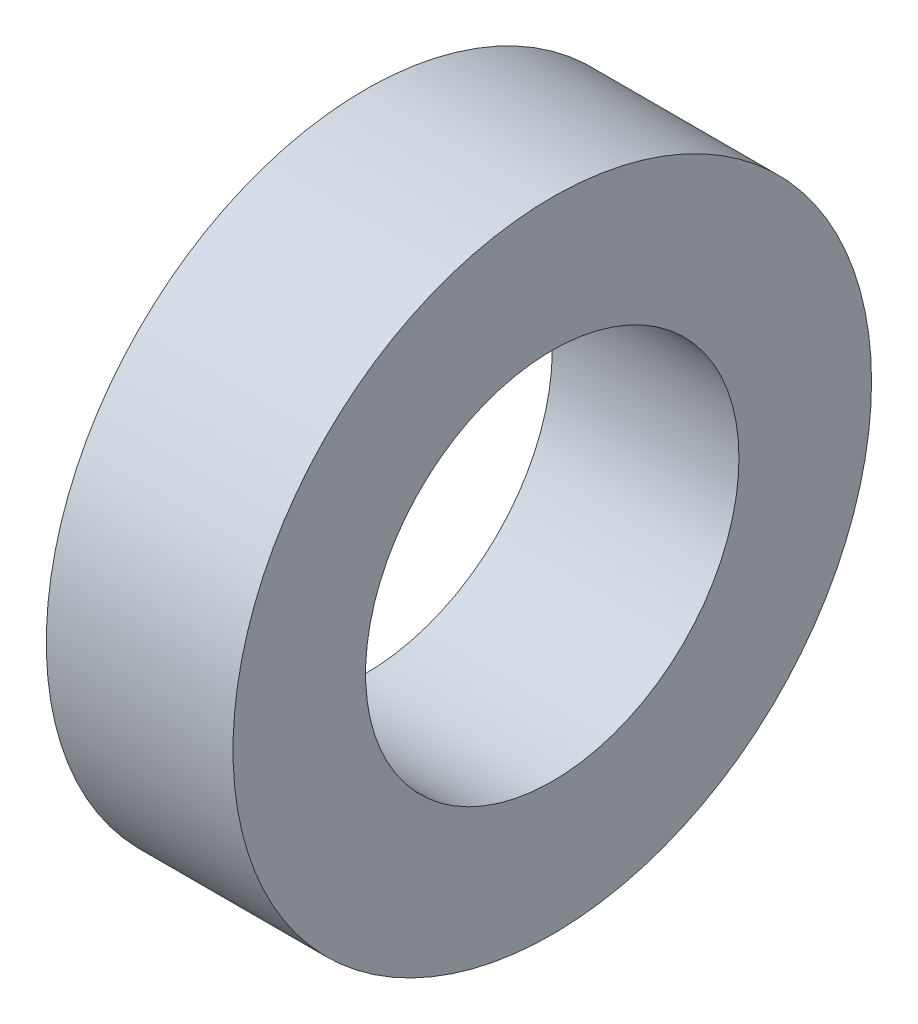
ISO-10303-21;
HEADER;
FILE_DESCRIPTION(('STEP AP214'),'2;1');
FILE_NAME('part.step','',(''),(''),'','','');
FILE_SCHEMA(('AUTOMOTIVE_DESIGN { 1 0 10303 214 1 1 1 1 }'));
ENDSEC;
DATA;
#1=APPLICATION_CONTEXT('core data for automotive mechanical design processes');
#2=APPLICATION_PROTOCOL_DEFINITION('international standard','automotive_design',2000,#1);
#3=PRODUCT_CONTEXT('',#1,'mechanical');
#4=PRODUCT('Part','Part','',(#3));
#5=PRODUCT_RELATED_PRODUCT_CATEGORY('part','',(#4));
#6=PRODUCT_DEFINITION_FORMATION('','',#4);
#7=PRODUCT_DEFINITION_CONTEXT('part definition',#1,'design');
#8=PRODUCT_DEFINITION('design','',#6,#7);
#9=PRODUCT_DEFINITION_SHAPE('','',#8);
#10=(LENGTH_UNIT() NAMED_UNIT(*) SI_UNIT(.MILLI.,.METRE.));
#11=(NAMED_UNIT(*) PLANE_ANGLE_UNIT() SI_UNIT($,.RADIAN.));
#12=(NAMED_UNIT(*) SI_UNIT($,.STERADIAN.) SOLID_ANGLE_UNIT());
#13=UNCERTAINTY_MEASURE_WITH_UNIT(LENGTH_MEASURE(1.E-05),#10,'distance_accuracy_value','');
#14=(GEOMETRIC_REPRESENTATION_CONTEXT(3) GLOBAL_UNCERTAINTY_ASSIGNED_CONTEXT((#13)) GLOBAL_UNIT_ASSIGNED_CONTEXT((#10,
#11,#12)) REPRESENTATION_CONTEXT('',''));
#15=CARTESIAN_POINT('',(0.,0.,0.));
#16=DIRECTION('',(0.,0.,1.));
#17=DIRECTION('',(1.,0.,0.));
#18=AXIS2_PLACEMENT_3D('',#15,#16,#17);
#19=CARTESIAN_POINT('',(5.,0.,0.));
#20=DIRECTION('',(-1.,0.,0.));
#21=DIRECTION('',(0.,0.,1.));
#22=AXIS2_PLACEMENT_3D('',#19,#20,#21);
#23=CYLINDRICAL_SURFACE('',#22,8.55);
#24=CARTESIAN_POINT('',(5.,0.,0.));
#25=DIRECTION('',(1.,0.,0.));
#26=DIRECTION('',(0.,0.,-1.));
#27=AXIS2_PLACEMENT_3D('',#24,#25,#26);
#28=CIRCLE('',#27,8.55);
#29=CARTESIAN_POINT('',(5.,0.,-8.55));
#30=VERTEX_POINT('',#29);
#31=EDGE_CURVE('E10',#30,#30,#28,.T.);
#32=ORIENTED_EDGE('',*,*,#31,.F.);
#33=EDGE_LOOP('',(#32));
#34=FACE_BOUND('',#33,.T.);
#35=CARTESIAN_POINT('',(0.,0.,0.));
#36=DIRECTION('',(1.,0.,0.));
#37=DIRECTION('',(0.,0.,-1.));
#38=AXIS2_PLACEMENT_3D('',#35,#36,#37);
#39=CIRCLE('',#38,8.55);
#40=CARTESIAN_POINT('',(0.,0.,-8.55));
#41=VERTEX_POINT('',#40);
#42=EDGE_CURVE('E36',#41,#41,#39,.T.);
#43=ORIENTED_EDGE('',*,*,#42,.T.);
#44=EDGE_LOOP('',(#43));
#45=FACE_BOUND('',#44,.T.);
#46=ADVANCED_FACE('F33',(#34,#45),#23,.T.);
#47=CARTESIAN_POINT('',(5.,0.,0.));
#48=DIRECTION('',(1.,0.,0.));
#49=DIRECTION('',(0.,0.,-1.));
#50=AXIS2_PLACEMENT_3D('',#47,#48,#49);
#51=PLANE('',#50);
#52=CARTESIAN_POINT('',(5.,0.,0.));
#53=DIRECTION('',(1.,0.,0.));
#54=DIRECTION('',(0.,0.,-1.));
#55=AXIS2_PLACEMENT_3D('',#52,#53,#54);
#56=CIRCLE('',#55,5.);
#57=CARTESIAN_POINT('',(5.,0.,-5.));
#58=VERTEX_POINT('',#57);
#59=EDGE_CURVE('E45',#58,#58,#56,.T.);
#60=ORIENTED_EDGE('',*,*,#59,.F.);
#61=EDGE_LOOP('',(#60));
#62=FACE_BOUND('',#61,.T.);
#63=ORIENTED_EDGE('',*,*,#31,.T.);
#64=EDGE_LOOP('',(#63));
#65=FACE_BOUND('',#64,.T.);
#66=ADVANCED_FACE('F60',(#62,#65),#51,.T.);
#67=CARTESIAN_POINT('',(0.,0.,0.));
#68=DIRECTION('',(1.,0.,0.));
#69=DIRECTION('',(0.,0.,-1.));
#70=AXIS2_PLACEMENT_3D('',#67,#68,#69);
#71=PLANE('',#70);
#72=CARTESIAN_POINT('',(0.,0.,0.));
#73=DIRECTION('',(1.,0.,0.));
#74=DIRECTION('',(0.,0.,-1.));
#75=AXIS2_PLACEMENT_3D('',#72,#73,#74);
#76=CIRCLE('',#75,5.);
#77=CARTESIAN_POINT('',(0.,0.,-5.));
#78=VERTEX_POINT('',#77);
#79=EDGE_CURVE('E43',#78,#78,#76,.T.);
#80=ORIENTED_EDGE('',*,*,#79,.T.);
#81=EDGE_LOOP('',(#80));
#82=FACE_BOUND('',#81,.T.);
#83=ORIENTED_EDGE('',*,*,#42,.F.);
#84=EDGE_LOOP('',(#83));
#85=FACE_BOUND('',#84,.T.);
#86=ADVANCED_FACE('F51',(#82,#85),#71,.F.);
#87=CARTESIAN_POINT('',(0.,0.,0.));
#88=DIRECTION('',(1.,0.,0.));
#89=DIRECTION('',(0.,0.,-1.));
#90=AXIS2_PLACEMENT_3D('',#87,#88,#89);
#91=CYLINDRICAL_SURFACE('',#90,5.);
#92=ORIENTED_EDGE('',*,*,#79,.F.);
#93=EDGE_LOOP('',(#92));
#94=FACE_BOUND('',#93,.T.);
#95=ORIENTED_EDGE('',*,*,#59,.T.);
#96=EDGE_LOOP('',(#95));
#97=FACE_BOUND('',#96,.T.);
#98=ADVANCED_FACE('F54',(#94,#97),#91,.F.);
#99=CLOSED_SHELL('',(#46,#66,#86,#98));
#100=MANIFOLD_SOLID_BREP('B2',#99);
#101=ADVANCED_BREP_SHAPE_REPRESENTATION('',(#18,#100),#14);
#102=SHAPE_DEFINITION_REPRESENTATION(#9,#101);
ENDSEC;
END-ISO-10303-21;
